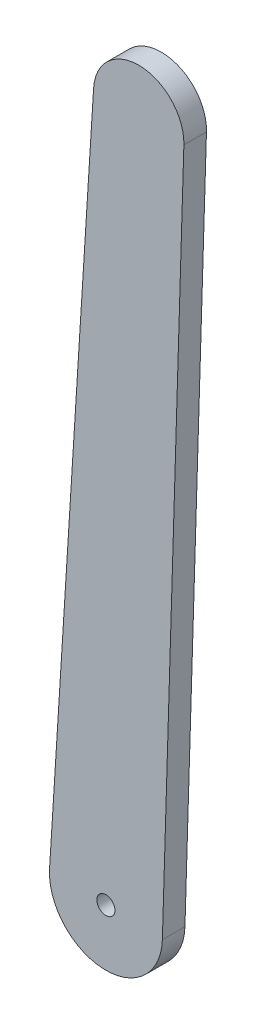
ISO-10303-21;
HEADER;
FILE_DESCRIPTION(('STEP AP214'),'2;1');
FILE_NAME('part.step','',(''),(''),'','','');
FILE_SCHEMA(('AUTOMOTIVE_DESIGN { 1 0 10303 214 1 1 1 1 }'));
ENDSEC;
DATA;
#1=APPLICATION_CONTEXT('core data for automotive mechanical design processes');
#2=APPLICATION_PROTOCOL_DEFINITION('international standard','automotive_design',2000,#1);
#3=PRODUCT_CONTEXT('',#1,'mechanical');
#4=PRODUCT('Part','Part','',(#3));
#5=PRODUCT_RELATED_PRODUCT_CATEGORY('part','',(#4));
#6=PRODUCT_DEFINITION_FORMATION('','',#4);
#7=PRODUCT_DEFINITION_CONTEXT('part definition',#1,'design');
#8=PRODUCT_DEFINITION('design','',#6,#7);
#9=PRODUCT_DEFINITION_SHAPE('','',#8);
#10=(LENGTH_UNIT() NAMED_UNIT(*) SI_UNIT(.MILLI.,.METRE.));
#11=(NAMED_UNIT(*) PLANE_ANGLE_UNIT() SI_UNIT($,.RADIAN.));
#12=(NAMED_UNIT(*) SI_UNIT($,.STERADIAN.) SOLID_ANGLE_UNIT());
#13=UNCERTAINTY_MEASURE_WITH_UNIT(LENGTH_MEASURE(1.E-05),#10,'distance_accuracy_value','');
#14=(GEOMETRIC_REPRESENTATION_CONTEXT(3) GLOBAL_UNCERTAINTY_ASSIGNED_CONTEXT((#13)) GLOBAL_UNIT_ASSIGNED_CONTEXT((#10,
#11,#12)) REPRESENTATION_CONTEXT('',''));
#15=CARTESIAN_POINT('',(0.,0.,0.));
#16=DIRECTION('',(0.,0.,1.));
#17=DIRECTION('',(1.,0.,0.));
#18=AXIS2_PLACEMENT_3D('',#15,#16,#17);
#19=CARTESIAN_POINT('',(15.5416799993005,-0.981251632451746,260.964116371449));
#20=DIRECTION('',(0.998012812603553,-0.0630113154849549,-1.64737168290973E-12));
#21=DIRECTION('',(0.0630113154849549,0.998012812603553,0.));
#22=AXIS2_PLACEMENT_3D('',#19,#20,#21);
#23=PLANE('',#22);
#24=DIRECTION('',(-0.0630113154849549,-0.998012812603553,1.04018967755278E-13));
#25=VECTOR('',#24,1.);
#26=CARTESIAN_POINT('',(15.5416799992963,-0.981251632451746,258.424116371449));
#27=LINE('',#26,#25);
#28=CARTESIAN_POINT('',(20.5840949122731,78.8836845442195,258.424116371441));
#29=VERTEX_POINT('',#28);
#30=CARTESIAN_POINT('',(15.6288954733021,0.400121853329466,258.424116371449));
#31=VERTEX_POINT('',#30);
#32=EDGE_CURVE('E110',#29,#31,#27,.T.);
#33=ORIENTED_EDGE('',*,*,#32,.T.);
#34=DIRECTION('',(-1.65065183743707E-12,0.,-1.));
#35=VECTOR('',#34,1.);
#36=CARTESIAN_POINT('',(15.6288954733063,0.400121853329466,260.964116371449));
#37=LINE('',#36,#35);
#38=CARTESIAN_POINT('',(15.6288954733063,0.400121853329466,260.964116371449));
#39=VERTEX_POINT('',#38);
#40=EDGE_CURVE('E11',#39,#31,#37,.T.);
#41=ORIENTED_EDGE('',*,*,#40,.F.);
#42=DIRECTION('',(-0.0630113154849549,-0.998012812603553,1.04018967755278E-13));
#43=VECTOR('',#42,1.);
#44=CARTESIAN_POINT('',(15.5416799993005,-0.981251632451746,260.964116371449));
#45=LINE('',#44,#43);
#46=CARTESIAN_POINT('',(20.5840949122772,78.8836845442195,260.964116371441));
#47=VERTEX_POINT('',#46);
#48=EDGE_CURVE('E95',#47,#39,#45,.T.);
#49=ORIENTED_EDGE('',*,*,#48,.F.);
#50=DIRECTION('',(-1.65065183743707E-12,0.,-1.));
#51=VECTOR('',#50,1.);
#52=CARTESIAN_POINT('',(20.5840949122772,78.8836845442195,260.964116371441));
#53=LINE('',#52,#51);
#54=EDGE_CURVE('E109',#47,#29,#53,.T.);
#55=ORIENTED_EDGE('',*,*,#54,.T.);
#56=EDGE_LOOP('',(#33,#41,#49,#55));
#57=FACE_BOUND('',#56,.T.);
#58=ADVANCED_FACE('F43',(#57),#23,.F.);
#59=CARTESIAN_POINT('',(21.9662768333389,0.,260.964116371438));
#60=DIRECTION('',(-1.65065183743707E-12,0.,-1.));
#61=DIRECTION('',(-1.,0.,1.65065183743707E-12));
#62=AXIS2_PLACEMENT_3D('',#59,#60,#61);
#63=CYLINDRICAL_SURFACE('',#62,6.35);
#64=CARTESIAN_POINT('',(21.9662768333347,0.,258.424116371438));
#65=DIRECTION('',(1.65079822496507E-12,0.,1.));
#66=DIRECTION('',(1.,0.,-1.65079822496507E-12));
#67=AXIS2_PLACEMENT_3D('',#64,#65,#66);
#68=CIRCLE('',#67,6.35);
#69=CARTESIAN_POINT('',(28.3132735924849,-0.195274523009568,258.424116371428));
#70=VERTEX_POINT('',#69);
#71=EDGE_CURVE('E99',#31,#70,#68,.T.);
#72=ORIENTED_EDGE('',*,*,#71,.T.);
#73=DIRECTION('',(-1.65065183743707E-12,0.,-1.));
#74=VECTOR('',#73,1.);
#75=CARTESIAN_POINT('',(28.3132735924891,-0.195274523009568,260.964116371428));
#76=LINE('',#75,#74);
#77=CARTESIAN_POINT('',(28.3132735924891,-0.195274523009568,260.964116371428));
#78=VERTEX_POINT('',#77);
#79=EDGE_CURVE('E51',#78,#70,#76,.T.);
#80=ORIENTED_EDGE('',*,*,#79,.F.);
#81=CARTESIAN_POINT('',(21.9662768333389,0.,260.964116371438));
#82=DIRECTION('',(1.65079822496507E-12,0.,1.));
#83=DIRECTION('',(1.,0.,-1.65079822496507E-12));
#84=AXIS2_PLACEMENT_3D('',#81,#82,#83);
#85=CIRCLE('',#84,6.35);
#86=EDGE_CURVE('E89',#39,#78,#85,.T.);
#87=ORIENTED_EDGE('',*,*,#86,.F.);
#88=ORIENTED_EDGE('',*,*,#40,.T.);
#89=EDGE_LOOP('',(#72,#80,#87,#88));
#90=FACE_BOUND('',#89,.T.);
#91=ADVANCED_FACE('F98',(#90),#63,.T.);
#92=CARTESIAN_POINT('',(28.2925005469463,-0.870459645501462,260.964116371428));
#93=DIRECTION('',(-0.999527048685074,0.030751893387334,1.64987115948004E-12));
#94=DIRECTION('',(-0.030751893387334,-0.999527048685074,0.));
#95=AXIS2_PLACEMENT_3D('',#92,#93,#94);
#96=PLANE('',#95);
#97=DIRECTION('',(0.030751893387334,0.999527048685074,0.));
#98=VECTOR('',#97,1.);
#99=CARTESIAN_POINT('',(28.2925005469421,-0.870459645501462,258.424116371428));
#100=LINE('',#99,#98);
#101=CARTESIAN_POINT('',(30.7315974076193,78.4073674431483,258.424116371424));
#102=VERTEX_POINT('',#101);
#103=EDGE_CURVE('E76',#70,#102,#100,.T.);
#104=ORIENTED_EDGE('',*,*,#103,.T.);
#105=DIRECTION('',(-1.65065183743707E-12,0.,-1.));
#106=VECTOR('',#105,1.);
#107=CARTESIAN_POINT('',(30.7315974076235,78.4073674431483,260.964116371424));
#108=LINE('',#107,#106);
#109=CARTESIAN_POINT('',(30.7315974076235,78.4073674431483,260.964116371424));
#110=VERTEX_POINT('',#109);
#111=EDGE_CURVE('E100',#110,#102,#108,.T.);
#112=ORIENTED_EDGE('',*,*,#111,.F.);
#113=DIRECTION('',(0.030751893387334,0.999527048685074,0.));
#114=VECTOR('',#113,1.);
#115=CARTESIAN_POINT('',(28.2925005469463,-0.870459645501462,260.964116371428));
#116=LINE('',#115,#114);
#117=EDGE_CURVE('E93',#78,#110,#116,.T.);
#118=ORIENTED_EDGE('',*,*,#117,.F.);
#119=ORIENTED_EDGE('',*,*,#79,.T.);
#120=EDGE_LOOP('',(#104,#112,#118,#119));
#121=FACE_BOUND('',#120,.T.);
#122=ADVANCED_FACE('F101',(#121),#96,.F.);
#123=CARTESIAN_POINT('',(25.6540000003033,78.5635870615559,260.964116371432));
#124=DIRECTION('',(-1.65065183743707E-12,0.,-1.));
#125=DIRECTION('',(-1.,0.,1.65065183743707E-12));
#126=AXIS2_PLACEMENT_3D('',#123,#124,#125);
#127=CYLINDRICAL_SURFACE('',#126,5.08);
#128=CARTESIAN_POINT('',(25.6540000002991,78.5635870615559,258.424116371432));
#129=DIRECTION('',(1.65079822496507E-12,0.,1.));
#130=DIRECTION('',(1.,0.,-1.65079822496507E-12));
#131=AXIS2_PLACEMENT_3D('',#128,#129,#130);
#132=CIRCLE('',#131,5.08);
#133=EDGE_CURVE('E82',#102,#29,#132,.T.);
#134=ORIENTED_EDGE('',*,*,#133,.T.);
#135=ORIENTED_EDGE('',*,*,#54,.F.);
#136=CARTESIAN_POINT('',(25.6540000003033,78.5635870615559,260.964116371432));
#137=DIRECTION('',(1.65079822496507E-12,0.,1.));
#138=DIRECTION('',(1.,0.,-1.65079822496507E-12));
#139=AXIS2_PLACEMENT_3D('',#136,#137,#138);
#140=CIRCLE('',#139,5.08);
#141=EDGE_CURVE('E59',#110,#47,#140,.T.);
#142=ORIENTED_EDGE('',*,*,#141,.F.);
#143=ORIENTED_EDGE('',*,*,#111,.T.);
#144=EDGE_LOOP('',(#134,#135,#142,#143));
#145=FACE_BOUND('',#144,.T.);
#146=ADVANCED_FACE('F120',(#145),#127,.T.);
#147=CARTESIAN_POINT('',(21.9662768333389,0.,260.964116371438));
#148=DIRECTION('',(-1.65065183743707E-12,0.,-1.));
#149=DIRECTION('',(-1.,0.,1.65065183743707E-12));
#150=AXIS2_PLACEMENT_3D('',#147,#148,#149);
#151=CYLINDRICAL_SURFACE('',#150,1.016);
#152=CARTESIAN_POINT('',(21.9662768333389,0.,260.964116371438));
#153=DIRECTION('',(1.65079822496507E-12,0.,1.));
#154=DIRECTION('',(1.,0.,-1.65079822496507E-12));
#155=AXIS2_PLACEMENT_3D('',#152,#153,#154);
#156=CIRCLE('',#155,1.016);
#157=CARTESIAN_POINT('',(22.9822768333389,0.,260.964116371437));
#158=VERTEX_POINT('',#157);
#159=EDGE_CURVE('E103',#158,#158,#156,.T.);
#160=ORIENTED_EDGE('',*,*,#159,.T.);
#161=EDGE_LOOP('',(#160));
#162=FACE_BOUND('',#161,.T.);
#163=CARTESIAN_POINT('',(21.9662768333347,0.,258.424116371438));
#164=DIRECTION('',(1.65079822496507E-12,0.,1.));
#165=DIRECTION('',(1.,0.,-1.65079822496507E-12));
#166=AXIS2_PLACEMENT_3D('',#163,#164,#165);
#167=CIRCLE('',#166,1.016);
#168=CARTESIAN_POINT('',(22.9822768333347,0.,258.424116371437));
#169=VERTEX_POINT('',#168);
#170=EDGE_CURVE('E116',#169,#169,#167,.T.);
#171=ORIENTED_EDGE('',*,*,#170,.F.);
#172=EDGE_LOOP('',(#171));
#173=FACE_BOUND('',#172,.T.);
#174=ADVANCED_FACE('F137',(#162,#173),#151,.F.);
#175=CARTESIAN_POINT('',(4.30797758577128E-10,0.,260.964116371475));
#176=DIRECTION('',(1.65079822496507E-12,0.,1.));
#177=DIRECTION('',(1.,0.,-1.65079822496507E-12));
#178=AXIS2_PLACEMENT_3D('',#175,#176,#177);
#179=PLANE('',#178);
#180=ORIENTED_EDGE('',*,*,#48,.T.);
#181=ORIENTED_EDGE('',*,*,#86,.T.);
#182=ORIENTED_EDGE('',*,*,#117,.T.);
#183=ORIENTED_EDGE('',*,*,#141,.T.);
#184=EDGE_LOOP('',(#180,#181,#182,#183));
#185=FACE_BOUND('',#184,.T.);
#186=ORIENTED_EDGE('',*,*,#159,.F.);
#187=EDGE_LOOP('',(#186));
#188=FACE_BOUND('',#187,.T.);
#189=ADVANCED_FACE('F90',(#185,#188),#179,.T.);
#190=CARTESIAN_POINT('',(4.26606666659168E-10,0.,258.424116371475));
#191=DIRECTION('',(1.65079822496507E-12,0.,1.));
#192=DIRECTION('',(1.,0.,-1.65079822496507E-12));
#193=AXIS2_PLACEMENT_3D('',#190,#191,#192);
#194=PLANE('',#193);
#195=ORIENTED_EDGE('',*,*,#32,.F.);
#196=ORIENTED_EDGE('',*,*,#133,.F.);
#197=ORIENTED_EDGE('',*,*,#103,.F.);
#198=ORIENTED_EDGE('',*,*,#71,.F.);
#199=EDGE_LOOP('',(#195,#196,#197,#198));
#200=FACE_BOUND('',#199,.T.);
#201=ORIENTED_EDGE('',*,*,#170,.T.);
#202=EDGE_LOOP('',(#201));
#203=FACE_BOUND('',#202,.T.);
#204=ADVANCED_FACE('F123',(#200,#203),#194,.F.);
#205=CLOSED_SHELL('',(#58,#91,#122,#146,#174,#189,#204));
#206=MANIFOLD_SOLID_BREP('B2',#205);
#207=ADVANCED_BREP_SHAPE_REPRESENTATION('',(#18,#206),#14);
#208=SHAPE_DEFINITION_REPRESENTATION(#9,#207);
ENDSEC;
END-ISO-10303-21;
